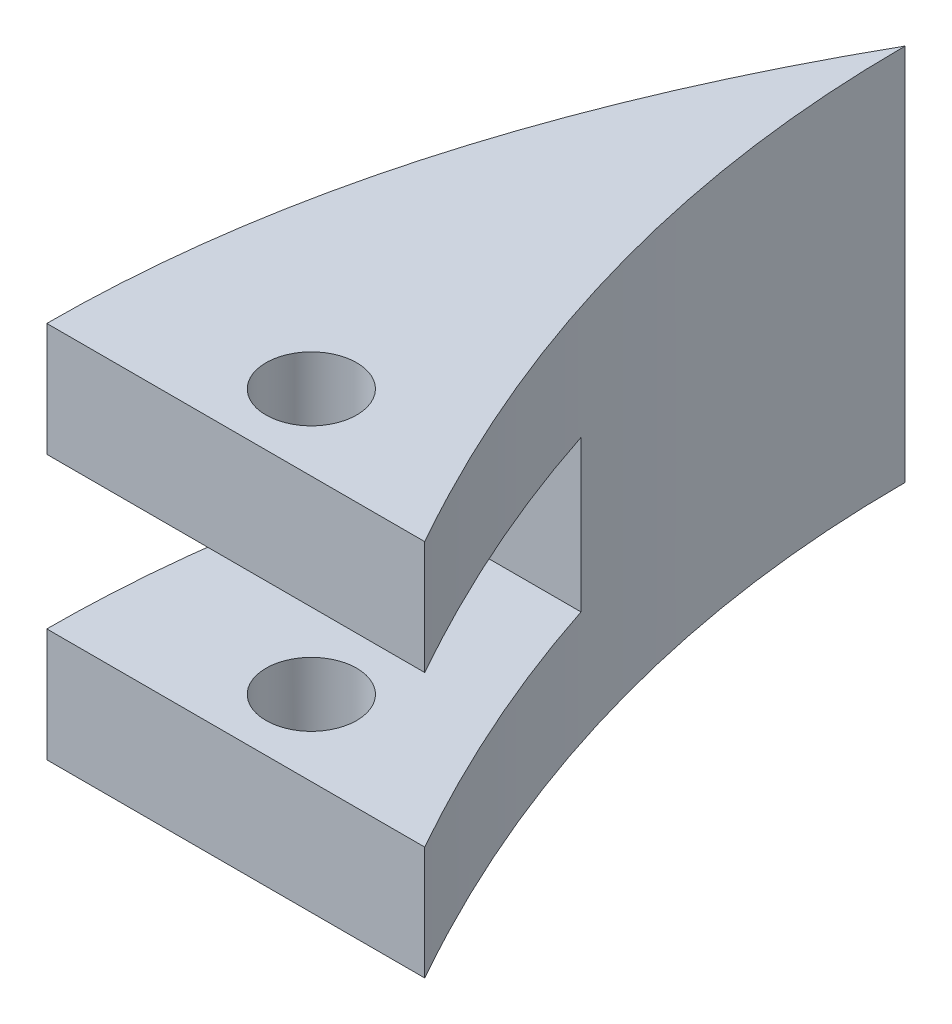
ISO-10303-21;
HEADER;
FILE_DESCRIPTION(('STEP AP214'),'2;1');
FILE_NAME('part.step','',(''),(''),'','','');
FILE_SCHEMA(('AUTOMOTIVE_DESIGN { 1 0 10303 214 1 1 1 1 }'));
ENDSEC;
DATA;
#1=APPLICATION_CONTEXT('core data for automotive mechanical design processes');
#2=APPLICATION_PROTOCOL_DEFINITION('international standard','automotive_design',2000,#1);
#3=PRODUCT_CONTEXT('',#1,'mechanical');
#4=PRODUCT('Part','Part','',(#3));
#5=PRODUCT_RELATED_PRODUCT_CATEGORY('part','',(#4));
#6=PRODUCT_DEFINITION_FORMATION('','',#4);
#7=PRODUCT_DEFINITION_CONTEXT('part definition',#1,'design');
#8=PRODUCT_DEFINITION('design','',#6,#7);
#9=PRODUCT_DEFINITION_SHAPE('','',#8);
#10=(LENGTH_UNIT() NAMED_UNIT(*) SI_UNIT(.MILLI.,.METRE.));
#11=(NAMED_UNIT(*) PLANE_ANGLE_UNIT() SI_UNIT($,.RADIAN.));
#12=(NAMED_UNIT(*) SI_UNIT($,.STERADIAN.) SOLID_ANGLE_UNIT());
#13=UNCERTAINTY_MEASURE_WITH_UNIT(LENGTH_MEASURE(1.E-05),#10,'distance_accuracy_value','');
#14=(GEOMETRIC_REPRESENTATION_CONTEXT(3) GLOBAL_UNCERTAINTY_ASSIGNED_CONTEXT((#13)) GLOBAL_UNIT_ASSIGNED_CONTEXT((#10,
#11,#12)) REPRESENTATION_CONTEXT('',''));
#15=CARTESIAN_POINT('',(0.,0.,0.));
#16=DIRECTION('',(0.,0.,1.));
#17=DIRECTION('',(1.,0.,0.));
#18=AXIS2_PLACEMENT_3D('',#15,#16,#17);
#19=CARTESIAN_POINT('',(-12.5,-12.5,44.2841737858594));
#20=DIRECTION('',(0.,1.,0.));
#21=DIRECTION('',(0.,0.,1.));
#22=AXIS2_PLACEMENT_3D('',#19,#20,#21);
#23=PLANE('',#22);
#24=CARTESIAN_POINT('',(0.,-12.5,39.2841737858594));
#25=DIRECTION('',(0.,1.,0.));
#26=DIRECTION('',(0.,0.,1.));
#27=AXIS2_PLACEMENT_3D('',#24,#25,#26);
#28=CIRCLE('',#27,3.);
#29=CARTESIAN_POINT('',(0.,-12.5,42.2841737858594));
#30=VERTEX_POINT('',#29);
#31=EDGE_CURVE('E142',#30,#30,#28,.T.);
#32=ORIENTED_EDGE('',*,*,#31,.T.);
#33=EDGE_LOOP('',(#32));
#34=FACE_BOUND('',#33,.T.);
#35=CARTESIAN_POINT('',(0.,-12.5,0.));
#36=CARTESIAN_POINT('',(-12.5,-12.5,22.1420868929297));
#37=CARTESIAN_POINT('',(-12.5,-12.5,44.2841737858594));
#38=B_SPLINE_CURVE_WITH_KNOTS('',2,(#35,#36,#37),.UNSPECIFIED.,.F.,.F.,(3,3),(0.,1.),.UNSPECIFIED.);
#39=CARTESIAN_POINT('',(0.,-12.5,0.));
#40=VERTEX_POINT('',#39);
#41=CARTESIAN_POINT('',(-12.5,-12.5,44.2841737858594));
#42=VERTEX_POINT('',#41);
#43=EDGE_CURVE('E290',#40,#42,#38,.T.);
#44=ORIENTED_EDGE('',*,*,#43,.F.);
#45=CARTESIAN_POINT('',(0.,-12.5,0.));
#46=CARTESIAN_POINT('',(-0.0130568639391416,-12.5,22.0589614943055));
#47=CARTESIAN_POINT('',(12.5,-12.5,44.2841737858594));
#48=B_SPLINE_CURVE_WITH_KNOTS('',2,(#45,#46,#47),.UNSPECIFIED.,.F.,.F.,(3,3),(0.,1.),.UNSPECIFIED.);
#49=CARTESIAN_POINT('',(12.5,-12.5,44.2841737858594));
#50=VERTEX_POINT('',#49);
#51=EDGE_CURVE('E182',#40,#50,#48,.T.);
#52=ORIENTED_EDGE('',*,*,#51,.T.);
#53=DIRECTION('',(1.,0.,0.));
#54=VECTOR('',#53,1.);
#55=CARTESIAN_POINT('',(-12.5,-12.5,44.2841737858594));
#56=LINE('',#55,#54);
#57=EDGE_CURVE('E79',#42,#50,#56,.T.);
#58=ORIENTED_EDGE('',*,*,#57,.F.);
#59=EDGE_LOOP('',(#44,#52,#58));
#60=FACE_BOUND('',#59,.T.);
#61=ADVANCED_FACE('F68',(#34,#60),#23,.F.);
#62=CARTESIAN_POINT('',(-12.5,12.5,44.2841737858594));
#63=DIRECTION('',(0.,1.,0.));
#64=DIRECTION('',(0.,0.,1.));
#65=AXIS2_PLACEMENT_3D('',#62,#63,#64);
#66=PLANE('',#65);
#67=CARTESIAN_POINT('',(0.,12.5,39.2841737858594));
#68=DIRECTION('',(0.,1.,0.));
#69=DIRECTION('',(0.,0.,1.));
#70=AXIS2_PLACEMENT_3D('',#67,#68,#69);
#71=CIRCLE('',#70,3.);
#72=CARTESIAN_POINT('',(0.,12.5,42.2841737858594));
#73=VERTEX_POINT('',#72);
#74=EDGE_CURVE('E224',#73,#73,#71,.T.);
#75=ORIENTED_EDGE('',*,*,#74,.F.);
#76=EDGE_LOOP('',(#75));
#77=FACE_BOUND('',#76,.T.);
#78=CARTESIAN_POINT('',(0.,12.5,0.));
#79=CARTESIAN_POINT('',(-0.0130568639391416,12.5,22.0589614943055));
#80=CARTESIAN_POINT('',(12.5,12.5,44.2841737858594));
#81=B_SPLINE_CURVE_WITH_KNOTS('',2,(#78,#79,#80),.UNSPECIFIED.,.F.,.F.,(3,3),(0.,1.),.UNSPECIFIED.);
#82=CARTESIAN_POINT('',(0.,12.5,0.));
#83=VERTEX_POINT('',#82);
#84=CARTESIAN_POINT('',(12.5,12.5,44.2841737858594));
#85=VERTEX_POINT('',#84);
#86=EDGE_CURVE('E147',#83,#85,#81,.T.);
#87=ORIENTED_EDGE('',*,*,#86,.F.);
#88=CARTESIAN_POINT('',(0.,12.5,0.));
#89=CARTESIAN_POINT('',(-12.5,12.5,22.1420868929297));
#90=CARTESIAN_POINT('',(-12.5,12.5,44.2841737858594));
#91=B_SPLINE_CURVE_WITH_KNOTS('',2,(#88,#89,#90),.UNSPECIFIED.,.F.,.F.,(3,3),(0.,1.),.UNSPECIFIED.);
#92=CARTESIAN_POINT('',(-12.5,12.5,44.2841737858594));
#93=VERTEX_POINT('',#92);
#94=EDGE_CURVE('E132',#83,#93,#91,.T.);
#95=ORIENTED_EDGE('',*,*,#94,.T.);
#96=DIRECTION('',(1.,0.,0.));
#97=VECTOR('',#96,1.);
#98=CARTESIAN_POINT('',(-12.5,12.5,44.2841737858594));
#99=LINE('',#98,#97);
#100=EDGE_CURVE('E146',#93,#85,#99,.T.);
#101=ORIENTED_EDGE('',*,*,#100,.T.);
#102=EDGE_LOOP('',(#87,#95,#101));
#103=FACE_BOUND('',#102,.T.);
#104=ADVANCED_FACE('F70',(#77,#103),#66,.T.);
#105=CARTESIAN_POINT('',(12.5,5.,25.6443389602607));
#106=DIRECTION('',(0.,1.,0.));
#107=DIRECTION('',(0.,0.,1.));
#108=AXIS2_PLACEMENT_3D('',#105,#106,#107);
#109=PLANE('',#108);
#110=CARTESIAN_POINT('',(0.,5.,39.2841737858594));
#111=DIRECTION('',(0.,1.,0.));
#112=DIRECTION('',(0.,0.,1.));
#113=AXIS2_PLACEMENT_3D('',#110,#111,#112);
#114=CIRCLE('',#113,3.);
#115=CARTESIAN_POINT('',(0.,5.,42.2841737858594));
#116=VERTEX_POINT('',#115);
#117=EDGE_CURVE('E227',#116,#116,#114,.F.);
#118=ORIENTED_EDGE('',*,*,#117,.F.);
#119=EDGE_LOOP('',(#118));
#120=FACE_BOUND('',#119,.T.);
#121=CARTESIAN_POINT('',(0.,4.99999999999999,0.));
#122=CARTESIAN_POINT('',(-12.5,4.99999999999999,22.1420868929297));
#123=CARTESIAN_POINT('',(-12.5,4.99999999999999,44.2841737858594));
#124=B_SPLINE_CURVE_WITH_KNOTS('',2,(#121,#122,#123),.UNSPECIFIED.,.F.,.F.,(3,3),(0.,1.),.UNSPECIFIED.);
#125=CARTESIAN_POINT('',(-10.2853911078959,4.99999999999999,25.6443389602607));
#126=VERTEX_POINT('',#125);
#127=CARTESIAN_POINT('',(-12.5,4.99999999999999,44.2841737858594));
#128=VERTEX_POINT('',#127);
#129=EDGE_CURVE('E135',#126,#128,#124,.T.);
#130=ORIENTED_EDGE('',*,*,#129,.F.);
#131=DIRECTION('',(-1.,0.,0.));
#132=VECTOR('',#131,1.);
#133=CARTESIAN_POINT('',(12.5,5.,25.6443389602607));
#134=LINE('',#133,#132);
#135=CARTESIAN_POINT('',(4.19864421421411,5.,25.6443389602607));
#136=VERTEX_POINT('',#135);
#137=EDGE_CURVE('E219',#136,#126,#134,.T.);
#138=ORIENTED_EDGE('',*,*,#137,.F.);
#139=CARTESIAN_POINT('',(0.,4.99999999999999,0.));
#140=CARTESIAN_POINT('',(-0.0130568639391416,4.99999999999999,22.0589614943055));
#141=CARTESIAN_POINT('',(12.5,4.99999999999999,44.2841737858594));
#142=B_SPLINE_CURVE_WITH_KNOTS('',2,(#139,#140,#141),.UNSPECIFIED.,.F.,.F.,(3,3),(0.,1.),.UNSPECIFIED.);
#143=CARTESIAN_POINT('',(12.5,4.99999999999998,44.2841737858594));
#144=VERTEX_POINT('',#143);
#145=EDGE_CURVE('E86',#136,#144,#142,.T.);
#146=ORIENTED_EDGE('',*,*,#145,.T.);
#147=DIRECTION('',(-1.,0.,0.));
#148=VECTOR('',#147,1.);
#149=CARTESIAN_POINT('',(12.5,5.,44.2841737858594));
#150=LINE('',#149,#148);
#151=EDGE_CURVE('E170',#144,#128,#150,.T.);
#152=ORIENTED_EDGE('',*,*,#151,.T.);
#153=EDGE_LOOP('',(#130,#138,#146,#152));
#154=FACE_BOUND('',#153,.T.);
#155=ADVANCED_FACE('F255',(#120,#154),#109,.F.);
#156=CARTESIAN_POINT('',(12.5,-5.,25.6443389602607));
#157=DIRECTION('',(0.,-1.,0.));
#158=DIRECTION('',(0.,0.,-1.));
#159=AXIS2_PLACEMENT_3D('',#156,#157,#158);
#160=PLANE('',#159);
#161=CARTESIAN_POINT('',(0.,-5.,39.2841737858594));
#162=DIRECTION('',(0.,-1.,0.));
#163=DIRECTION('',(0.,0.,-1.));
#164=AXIS2_PLACEMENT_3D('',#161,#162,#163);
#165=CIRCLE('',#164,3.);
#166=CARTESIAN_POINT('',(0.,-5.,36.2841737858594));
#167=VERTEX_POINT('',#166);
#168=EDGE_CURVE('E222',#167,#167,#165,.F.);
#169=ORIENTED_EDGE('',*,*,#168,.F.);
#170=EDGE_LOOP('',(#169));
#171=FACE_BOUND('',#170,.T.);
#172=CARTESIAN_POINT('',(0.,-5.,0.));
#173=CARTESIAN_POINT('',(-12.5,-5.,22.1420868929297));
#174=CARTESIAN_POINT('',(-12.5,-5.,44.2841737858594));
#175=B_SPLINE_CURVE_WITH_KNOTS('',2,(#172,#173,#174),.UNSPECIFIED.,.F.,.F.,(3,3),(0.,1.),.UNSPECIFIED.);
#176=CARTESIAN_POINT('',(-12.5,-5.,44.2841737858594));
#177=VERTEX_POINT('',#176);
#178=CARTESIAN_POINT('',(-10.2853911078959,-5.,25.6443389602607));
#179=VERTEX_POINT('',#178);
#180=EDGE_CURVE('E296',#177,#179,#175,.F.);
#181=ORIENTED_EDGE('',*,*,#180,.F.);
#182=DIRECTION('',(1.,0.,0.));
#183=VECTOR('',#182,1.);
#184=CARTESIAN_POINT('',(12.5,-5.,44.2841737858594));
#185=LINE('',#184,#183);
#186=CARTESIAN_POINT('',(12.5,-5.00000000000001,44.2841737858594));
#187=VERTEX_POINT('',#186);
#188=EDGE_CURVE('E173',#177,#187,#185,.T.);
#189=ORIENTED_EDGE('',*,*,#188,.T.);
#190=CARTESIAN_POINT('',(0.,-5.,0.));
#191=CARTESIAN_POINT('',(-0.0130568639391416,-5.,22.0589614943055));
#192=CARTESIAN_POINT('',(12.5,-5.,44.2841737858594));
#193=B_SPLINE_CURVE_WITH_KNOTS('',2,(#190,#191,#192),.UNSPECIFIED.,.F.,.F.,(3,3),(0.,1.),.UNSPECIFIED.);
#194=CARTESIAN_POINT('',(4.19864421421411,-5.,25.6443389602607));
#195=VERTEX_POINT('',#194);
#196=EDGE_CURVE('E179',#187,#195,#193,.F.);
#197=ORIENTED_EDGE('',*,*,#196,.T.);
#198=DIRECTION('',(1.,0.,0.));
#199=VECTOR('',#198,1.);
#200=CARTESIAN_POINT('',(12.5,-5.,25.6443389602607));
#201=LINE('',#200,#199);
#202=EDGE_CURVE('E93',#179,#195,#201,.T.);
#203=ORIENTED_EDGE('',*,*,#202,.F.);
#204=EDGE_LOOP('',(#181,#189,#197,#203));
#205=FACE_BOUND('',#204,.T.);
#206=ADVANCED_FACE('F260',(#171,#205),#160,.F.);
#207=CARTESIAN_POINT('',(0.,0.,25.6443389602607));
#208=DIRECTION('',(0.,0.,1.));
#209=DIRECTION('',(1.,0.,0.));
#210=AXIS2_PLACEMENT_3D('',#207,#208,#209);
#211=PLANE('',#210);
#212=ORIENTED_EDGE('',*,*,#137,.T.);
#213=DIRECTION('',(0.,1.,0.));
#214=VECTOR('',#213,1.);
#215=CARTESIAN_POINT('',(-10.2853911078959,-17.5,25.6443389602607));
#216=LINE('',#215,#214);
#217=EDGE_CURVE('E149',#126,#179,#216,.F.);
#218=ORIENTED_EDGE('',*,*,#217,.T.);
#219=ORIENTED_EDGE('',*,*,#202,.T.);
#220=DIRECTION('',(0.,1.,0.));
#221=VECTOR('',#220,1.);
#222=CARTESIAN_POINT('',(4.19864421421411,-17.5,25.6443389602607));
#223=LINE('',#222,#221);
#224=EDGE_CURVE('E12',#136,#195,#223,.F.);
#225=ORIENTED_EDGE('',*,*,#224,.F.);
#226=EDGE_LOOP('',(#212,#218,#219,#225));
#227=FACE_BOUND('',#226,.T.);
#228=ADVANCED_FACE('F268',(#227),#211,.T.);
#229=CARTESIAN_POINT('',(0.,0.,44.2841737858594));
#230=DIRECTION('',(0.,0.,-1.));
#231=DIRECTION('',(-1.,0.,0.));
#232=AXIS2_PLACEMENT_3D('',#229,#230,#231);
#233=PLANE('',#232);
#234=DIRECTION('',(0.,1.,0.));
#235=VECTOR('',#234,1.);
#236=CARTESIAN_POINT('',(-12.5,-12.5,44.2841737858594));
#237=LINE('',#236,#235);
#238=EDGE_CURVE('E72',#128,#93,#237,.T.);
#239=ORIENTED_EDGE('',*,*,#238,.F.);
#240=ORIENTED_EDGE('',*,*,#151,.F.);
#241=DIRECTION('',(0.,1.,0.));
#242=VECTOR('',#241,1.);
#243=CARTESIAN_POINT('',(12.5,-12.5,44.2841737858594));
#244=LINE('',#243,#242);
#245=EDGE_CURVE('E153',#144,#85,#244,.T.);
#246=ORIENTED_EDGE('',*,*,#245,.T.);
#247=ORIENTED_EDGE('',*,*,#100,.F.);
#248=EDGE_LOOP('',(#239,#240,#246,#247));
#249=FACE_BOUND('',#248,.T.);
#250=ADVANCED_FACE('F152',(#249),#233,.F.);
#251=CARTESIAN_POINT('',(0.,-23.8445328510129,39.2841737858594));
#252=DIRECTION('',(0.,1.,0.));
#253=DIRECTION('',(0.,0.,1.));
#254=AXIS2_PLACEMENT_3D('',#251,#252,#253);
#255=CYLINDRICAL_SURFACE('',#254,3.);
#256=ORIENTED_EDGE('',*,*,#117,.T.);
#257=EDGE_LOOP('',(#256));
#258=FACE_BOUND('',#257,.T.);
#259=ORIENTED_EDGE('',*,*,#74,.T.);
#260=EDGE_LOOP('',(#259));
#261=FACE_BOUND('',#260,.T.);
#262=ADVANCED_FACE('F239',(#258,#261),#255,.F.);
#263=EDGE_CURVE('E158',#50,#187,#244,.T.);
#264=ORIENTED_EDGE('',*,*,#263,.T.);
#265=ORIENTED_EDGE('',*,*,#188,.F.);
#266=EDGE_CURVE('E141',#42,#177,#237,.T.);
#267=ORIENTED_EDGE('',*,*,#266,.F.);
#268=ORIENTED_EDGE('',*,*,#57,.T.);
#269=EDGE_LOOP('',(#264,#265,#267,#268));
#270=FACE_BOUND('',#269,.T.);
#271=ADVANCED_FACE('F236',(#270),#233,.F.);
#272=ORIENTED_EDGE('',*,*,#168,.T.);
#273=EDGE_LOOP('',(#272));
#274=FACE_BOUND('',#273,.T.);
#275=ORIENTED_EDGE('',*,*,#31,.F.);
#276=EDGE_LOOP('',(#275));
#277=FACE_BOUND('',#276,.T.);
#278=ADVANCED_FACE('F233',(#274,#277),#255,.F.);
#279=CARTESIAN_POINT('',(0.,-17.5,0.));
#280=CARTESIAN_POINT('',(-0.0130568639391416,-17.5,22.0589614943055));
#281=CARTESIAN_POINT('',(12.5,-17.5,44.2841737858594));
#282=B_SPLINE_CURVE_WITH_KNOTS('',2,(#279,#280,#281),.UNSPECIFIED.,.F.,.F.,(3,3),(0.,1.),.UNSPECIFIED.);
#283=DIRECTION('',(0.,1.,0.));
#284=VECTOR('',#283,1.);
#285=SURFACE_OF_LINEAR_EXTRUSION('',#282,#284);
#286=DIRECTION('',(0.,1.,0.));
#287=VECTOR('',#286,1.);
#288=CARTESIAN_POINT('',(0.,-17.5,0.));
#289=LINE('',#288,#287);
#290=EDGE_CURVE('E176',#40,#83,#289,.T.);
#291=ORIENTED_EDGE('',*,*,#290,.T.);
#292=ORIENTED_EDGE('',*,*,#86,.T.);
#293=ORIENTED_EDGE('',*,*,#245,.F.);
#294=ORIENTED_EDGE('',*,*,#145,.F.);
#295=ORIENTED_EDGE('',*,*,#224,.T.);
#296=ORIENTED_EDGE('',*,*,#196,.F.);
#297=ORIENTED_EDGE('',*,*,#263,.F.);
#298=ORIENTED_EDGE('',*,*,#51,.F.);
#299=EDGE_LOOP('',(#291,#292,#293,#294,#295,#296,#297,#298));
#300=FACE_BOUND('',#299,.T.);
#301=ADVANCED_FACE('F235',(#300),#285,.F.);
#302=CARTESIAN_POINT('',(0.,-17.5,0.));
#303=CARTESIAN_POINT('',(-12.5,-17.5,22.1420868929297));
#304=CARTESIAN_POINT('',(-12.5,-17.5,44.2841737858594));
#305=B_SPLINE_CURVE_WITH_KNOTS('',2,(#302,#303,#304),.UNSPECIFIED.,.F.,.F.,(3,3),(0.,1.),.UNSPECIFIED.);
#306=DIRECTION('',(0.,1.,0.));
#307=VECTOR('',#306,1.);
#308=SURFACE_OF_LINEAR_EXTRUSION('',#305,#307);
#309=ORIENTED_EDGE('',*,*,#43,.T.);
#310=ORIENTED_EDGE('',*,*,#266,.T.);
#311=ORIENTED_EDGE('',*,*,#180,.T.);
#312=ORIENTED_EDGE('',*,*,#217,.F.);
#313=ORIENTED_EDGE('',*,*,#129,.T.);
#314=ORIENTED_EDGE('',*,*,#238,.T.);
#315=ORIENTED_EDGE('',*,*,#94,.F.);
#316=ORIENTED_EDGE('',*,*,#290,.F.);
#317=EDGE_LOOP('',(#309,#310,#311,#312,#313,#314,#315,#316));
#318=FACE_BOUND('',#317,.T.);
#319=ADVANCED_FACE('F131',(#318),#308,.T.);
#320=CLOSED_SHELL('',(#61,#104,#155,#206,#228,#250,#262,#271,#278,#301,#319));
#321=MANIFOLD_SOLID_BREP('B2',#320);
#322=ADVANCED_BREP_SHAPE_REPRESENTATION('',(#18,#321),#14);
#323=SHAPE_DEFINITION_REPRESENTATION(#9,#322);
ENDSEC;
END-ISO-10303-21;
